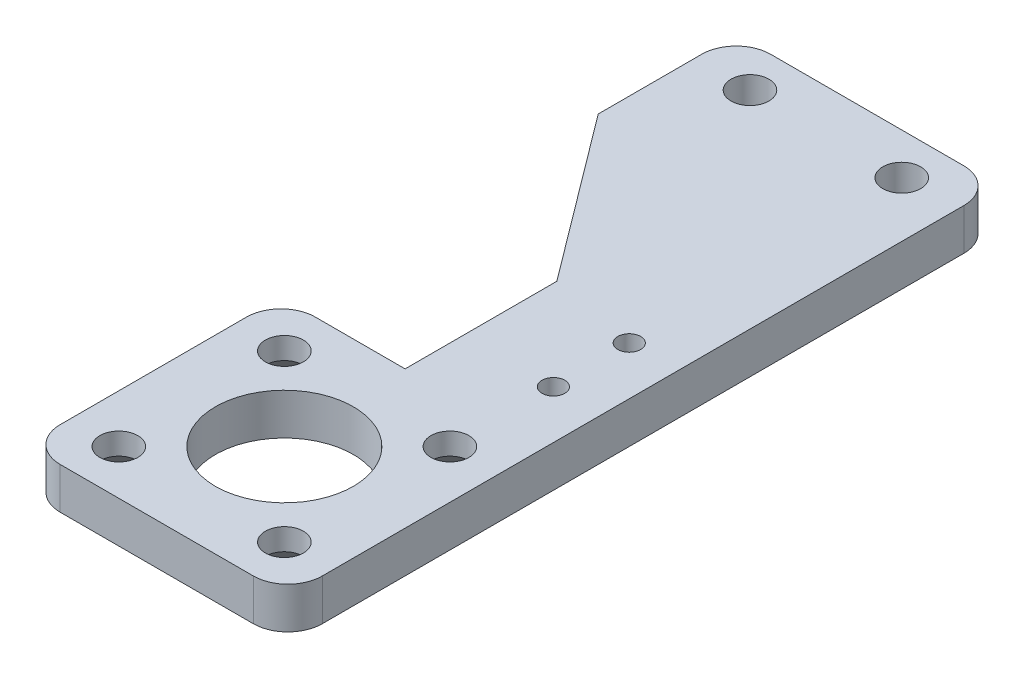
ISO-10303-21;
HEADER;
FILE_DESCRIPTION(('STEP AP214'),'2;1');
FILE_NAME('part.step','',(''),(''),'','','');
FILE_SCHEMA(('AUTOMOTIVE_DESIGN { 1 0 10303 214 1 1 1 1 }'));
ENDSEC;
DATA;
#1=APPLICATION_CONTEXT('core data for automotive mechanical design processes');
#2=APPLICATION_PROTOCOL_DEFINITION('international standard','automotive_design',2000,#1);
#3=PRODUCT_CONTEXT('',#1,'mechanical');
#4=PRODUCT('Part','Part','',(#3));
#5=PRODUCT_RELATED_PRODUCT_CATEGORY('part','',(#4));
#6=PRODUCT_DEFINITION_FORMATION('','',#4);
#7=PRODUCT_DEFINITION_CONTEXT('part definition',#1,'design');
#8=PRODUCT_DEFINITION('design','',#6,#7);
#9=PRODUCT_DEFINITION_SHAPE('','',#8);
#10=(LENGTH_UNIT() NAMED_UNIT(*) SI_UNIT(.MILLI.,.METRE.));
#11=(NAMED_UNIT(*) PLANE_ANGLE_UNIT() SI_UNIT($,.RADIAN.));
#12=(NAMED_UNIT(*) SI_UNIT($,.STERADIAN.) SOLID_ANGLE_UNIT());
#13=UNCERTAINTY_MEASURE_WITH_UNIT(LENGTH_MEASURE(1.E-05),#10,'distance_accuracy_value','');
#14=(GEOMETRIC_REPRESENTATION_CONTEXT(3) GLOBAL_UNCERTAINTY_ASSIGNED_CONTEXT((#13)) GLOBAL_UNIT_ASSIGNED_CONTEXT((#10,
#11,#12)) REPRESENTATION_CONTEXT('',''));
#15=CARTESIAN_POINT('',(0.,0.,0.));
#16=DIRECTION('',(0.,0.,1.));
#17=DIRECTION('',(1.,0.,0.));
#18=AXIS2_PLACEMENT_3D('',#15,#16,#17);
#19=CARTESIAN_POINT('',(-19.,-3.,51.5));
#20=DIRECTION('',(0.,1.,0.));
#21=DIRECTION('',(0.,0.,1.));
#22=AXIS2_PLACEMENT_3D('',#19,#20,#21);
#23=PLANE('',#22);
#24=CARTESIAN_POINT('',(11.,-3.,-45.5));
#25=DIRECTION('',(0.,1.,0.));
#26=DIRECTION('',(0.,0.,1.));
#27=AXIS2_PLACEMENT_3D('',#24,#25,#26);
#28=CIRCLE('',#27,2.75);
#29=CARTESIAN_POINT('',(11.,-3.,-42.75));
#30=VERTEX_POINT('',#29);
#31=EDGE_CURVE('E604',#30,#30,#28,.T.);
#32=ORIENTED_EDGE('',*,*,#31,.T.);
#33=EDGE_LOOP('',(#32));
#34=FACE_BOUND('',#33,.T.);
#35=CARTESIAN_POINT('',(-11.,-3.,-45.5));
#36=DIRECTION('',(0.,1.,0.));
#37=DIRECTION('',(0.,0.,1.));
#38=AXIS2_PLACEMENT_3D('',#35,#36,#37);
#39=CIRCLE('',#38,2.75);
#40=CARTESIAN_POINT('',(-11.,-3.,-42.75));
#41=VERTEX_POINT('',#40);
#42=EDGE_CURVE('E602',#41,#41,#39,.T.);
#43=ORIENTED_EDGE('',*,*,#42,.T.);
#44=EDGE_LOOP('',(#43));
#45=FACE_BOUND('',#44,.T.);
#46=CARTESIAN_POINT('',(12.,-3.,-5.));
#47=DIRECTION('',(0.,1.,0.));
#48=DIRECTION('',(0.,0.,1.));
#49=AXIS2_PLACEMENT_3D('',#46,#47,#48);
#50=CIRCLE('',#49,1.65);
#51=CARTESIAN_POINT('',(12.,-3.,-3.35));
#52=VERTEX_POINT('',#51);
#53=EDGE_CURVE('E598',#52,#52,#50,.T.);
#54=ORIENTED_EDGE('',*,*,#53,.T.);
#55=EDGE_LOOP('',(#54));
#56=FACE_BOUND('',#55,.T.);
#57=CARTESIAN_POINT('',(12.,-3.,6.));
#58=DIRECTION('',(0.,1.,0.));
#59=DIRECTION('',(0.,0.,1.));
#60=AXIS2_PLACEMENT_3D('',#57,#58,#59);
#61=CIRCLE('',#60,1.65);
#62=CARTESIAN_POINT('',(12.,-3.,7.65));
#63=VERTEX_POINT('',#62);
#64=EDGE_CURVE('E594',#63,#63,#61,.T.);
#65=ORIENTED_EDGE('',*,*,#64,.T.);
#66=EDGE_LOOP('',(#65));
#67=FACE_BOUND('',#66,.T.);
#68=CARTESIAN_POINT('',(12.,-3.,45.));
#69=DIRECTION('',(0.,-1.,0.));
#70=DIRECTION('',(0.,0.,-1.));
#71=AXIS2_PLACEMENT_3D('',#68,#69,#70);
#72=CIRCLE('',#71,5.6);
#73=CARTESIAN_POINT('',(12.,-3.,39.4));
#74=VERTEX_POINT('',#73);
#75=EDGE_CURVE('E591',#74,#74,#72,.T.);
#76=ORIENTED_EDGE('',*,*,#75,.F.);
#77=EDGE_LOOP('',(#76));
#78=FACE_BOUND('',#77,.T.);
#79=DIRECTION('',(0.,0.,1.));
#80=VECTOR('',#79,1.);
#81=CARTESIAN_POINT('',(-19.,-3.,-51.5));
#82=LINE('',#81,#80);
#83=CARTESIAN_POINT('',(-19.,-3.,19.5));
#84=VERTEX_POINT('',#83);
#85=CARTESIAN_POINT('',(-19.,-3.,46.5));
#86=VERTEX_POINT('',#85);
#87=EDGE_CURVE('E166',#84,#86,#82,.T.);
#88=ORIENTED_EDGE('',*,*,#87,.F.);
#89=CARTESIAN_POINT('',(-14.,-3.,19.5));
#90=DIRECTION('',(0.,1.,0.));
#91=DIRECTION('',(0.,0.,1.));
#92=AXIS2_PLACEMENT_3D('',#89,#90,#91);
#93=CIRCLE('',#92,5.);
#94=CARTESIAN_POINT('',(-14.,-3.,14.5));
#95=VERTEX_POINT('',#94);
#96=EDGE_CURVE('E214',#84,#95,#93,.F.);
#97=ORIENTED_EDGE('',*,*,#96,.T.);
#98=DIRECTION('',(1.,0.,0.));
#99=VECTOR('',#98,1.);
#100=CARTESIAN_POINT('',(-19.,-3.,14.5));
#101=LINE('',#100,#99);
#102=CARTESIAN_POINT('',(-1.00000000000001,-3.,14.5));
#103=VERTEX_POINT('',#102);
#104=EDGE_CURVE('E155',#95,#103,#101,.T.);
#105=ORIENTED_EDGE('',*,*,#104,.T.);
#106=DIRECTION('',(0.,0.,-1.));
#107=VECTOR('',#106,1.);
#108=CARTESIAN_POINT('',(-1.00000000000001,-3.,14.5));
#109=LINE('',#108,#107);
#110=CARTESIAN_POINT('',(-1.00000000000001,-3.,-7.5));
#111=VERTEX_POINT('',#110);
#112=EDGE_CURVE('E135',#103,#111,#109,.T.);
#113=ORIENTED_EDGE('',*,*,#112,.T.);
#114=DIRECTION('',(-0.6,0.,-0.8));
#115=VECTOR('',#114,1.);
#116=CARTESIAN_POINT('',(-1.00000000000001,-3.,-7.5));
#117=LINE('',#116,#115);
#118=CARTESIAN_POINT('',(-19.,-3.,-31.5));
#119=VERTEX_POINT('',#118);
#120=EDGE_CURVE('E147',#111,#119,#117,.T.);
#121=ORIENTED_EDGE('',*,*,#120,.T.);
#122=CARTESIAN_POINT('',(-19.,-3.,-46.5));
#123=VERTEX_POINT('',#122);
#124=EDGE_CURVE('E182',#123,#119,#82,.T.);
#125=ORIENTED_EDGE('',*,*,#124,.F.);
#126=CARTESIAN_POINT('',(-14.,-3.,-46.5));
#127=DIRECTION('',(0.,1.,0.));
#128=DIRECTION('',(0.,0.,1.));
#129=AXIS2_PLACEMENT_3D('',#126,#127,#128);
#130=CIRCLE('',#129,5.);
#131=CARTESIAN_POINT('',(-14.,-3.,-51.5));
#132=VERTEX_POINT('',#131);
#133=EDGE_CURVE('E212',#123,#132,#130,.F.);
#134=ORIENTED_EDGE('',*,*,#133,.T.);
#135=DIRECTION('',(-1.,0.,0.));
#136=VECTOR('',#135,1.);
#137=CARTESIAN_POINT('',(-19.,-3.,-51.5));
#138=LINE('',#137,#136);
#139=CARTESIAN_POINT('',(14.,-3.,-51.5));
#140=VERTEX_POINT('',#139);
#141=EDGE_CURVE('E189',#140,#132,#138,.T.);
#142=ORIENTED_EDGE('',*,*,#141,.F.);
#143=CARTESIAN_POINT('',(14.,-3.,-46.5));
#144=DIRECTION('',(0.,1.,0.));
#145=DIRECTION('',(0.,0.,1.));
#146=AXIS2_PLACEMENT_3D('',#143,#144,#145);
#147=CIRCLE('',#146,5.);
#148=CARTESIAN_POINT('',(19.,-3.,-46.5));
#149=VERTEX_POINT('',#148);
#150=EDGE_CURVE('E210',#140,#149,#147,.F.);
#151=ORIENTED_EDGE('',*,*,#150,.T.);
#152=DIRECTION('',(0.,0.,-1.));
#153=VECTOR('',#152,1.);
#154=CARTESIAN_POINT('',(19.,-3.,-51.5));
#155=LINE('',#154,#153);
#156=CARTESIAN_POINT('',(19.,-3.,46.5));
#157=VERTEX_POINT('',#156);
#158=EDGE_CURVE('E186',#157,#149,#155,.T.);
#159=ORIENTED_EDGE('',*,*,#158,.F.);
#160=CARTESIAN_POINT('',(14.,-3.,46.5));
#161=DIRECTION('',(0.,1.,0.));
#162=DIRECTION('',(0.,0.,1.));
#163=AXIS2_PLACEMENT_3D('',#160,#161,#162);
#164=CIRCLE('',#163,5.);
#165=CARTESIAN_POINT('',(14.,-3.,51.5));
#166=VERTEX_POINT('',#165);
#167=EDGE_CURVE('E49',#157,#166,#164,.F.);
#168=ORIENTED_EDGE('',*,*,#167,.T.);
#169=DIRECTION('',(1.,0.,0.));
#170=VECTOR('',#169,1.);
#171=CARTESIAN_POINT('',(-19.,-3.,51.5));
#172=LINE('',#171,#170);
#173=CARTESIAN_POINT('',(-14.,-3.,51.5));
#174=VERTEX_POINT('',#173);
#175=EDGE_CURVE('E184',#174,#166,#172,.T.);
#176=ORIENTED_EDGE('',*,*,#175,.F.);
#177=CARTESIAN_POINT('',(-14.,-3.,46.5));
#178=DIRECTION('',(0.,1.,0.));
#179=DIRECTION('',(0.,0.,1.));
#180=AXIS2_PLACEMENT_3D('',#177,#178,#179);
#181=CIRCLE('',#180,5.);
#182=EDGE_CURVE('E57',#174,#86,#181,.F.);
#183=ORIENTED_EDGE('',*,*,#182,.T.);
#184=EDGE_LOOP('',(#88,#97,#105,#113,#121,#125,#134,#142,#151,#159,#168,#176,#183));
#185=FACE_BOUND('',#184,.T.);
#186=CARTESIAN_POINT('',(0.,-3.,33.));
#187=DIRECTION('',(0.,1.,0.));
#188=DIRECTION('',(0.,0.,1.));
#189=AXIS2_PLACEMENT_3D('',#186,#187,#188);
#190=CIRCLE('',#189,10.);
#191=CARTESIAN_POINT('',(0.,-3.,43.));
#192=VERTEX_POINT('',#191);
#193=EDGE_CURVE('E163',#192,#192,#190,.T.);
#194=ORIENTED_EDGE('',*,*,#193,.T.);
#195=EDGE_LOOP('',(#194));
#196=FACE_BOUND('',#195,.T.);
#197=CARTESIAN_POINT('',(12.,-3.,21.));
#198=DIRECTION('',(0.,-1.,0.));
#199=DIRECTION('',(0.,0.,-1.));
#200=AXIS2_PLACEMENT_3D('',#197,#198,#199);
#201=CIRCLE('',#200,5.6);
#202=CARTESIAN_POINT('',(12.,-3.,15.4));
#203=VERTEX_POINT('',#202);
#204=EDGE_CURVE('E570',#203,#203,#201,.T.);
#205=ORIENTED_EDGE('',*,*,#204,.F.);
#206=EDGE_LOOP('',(#205));
#207=FACE_BOUND('',#206,.T.);
#208=CARTESIAN_POINT('',(-12.,-3.,21.));
#209=DIRECTION('',(0.,-1.,0.));
#210=DIRECTION('',(0.,0.,-1.));
#211=AXIS2_PLACEMENT_3D('',#208,#209,#210);
#212=CIRCLE('',#211,5.6);
#213=CARTESIAN_POINT('',(-12.,-3.,15.4));
#214=VERTEX_POINT('',#213);
#215=EDGE_CURVE('E577',#214,#214,#212,.T.);
#216=ORIENTED_EDGE('',*,*,#215,.F.);
#217=EDGE_LOOP('',(#216));
#218=FACE_BOUND('',#217,.T.);
#219=CARTESIAN_POINT('',(-12.,-3.,45.));
#220=DIRECTION('',(0.,-1.,0.));
#221=DIRECTION('',(0.,0.,-1.));
#222=AXIS2_PLACEMENT_3D('',#219,#220,#221);
#223=CIRCLE('',#222,5.6);
#224=CARTESIAN_POINT('',(-12.,-3.,39.4));
#225=VERTEX_POINT('',#224);
#226=EDGE_CURVE('E584',#225,#225,#223,.T.);
#227=ORIENTED_EDGE('',*,*,#226,.F.);
#228=EDGE_LOOP('',(#227));
#229=FACE_BOUND('',#228,.T.);
#230=ADVANCED_FACE('F34',(#34,#45,#56,#67,#78,#185,#196,#207,#218,#229),#23,.F.);
#231=CARTESIAN_POINT('',(-19.,3.,-51.5));
#232=DIRECTION('',(1.,0.,0.));
#233=DIRECTION('',(0.,0.,-1.));
#234=AXIS2_PLACEMENT_3D('',#231,#232,#233);
#235=PLANE('',#234);
#236=DIRECTION('',(0.,0.,1.));
#237=VECTOR('',#236,1.);
#238=CARTESIAN_POINT('',(-19.,3.,-51.5));
#239=LINE('',#238,#237);
#240=CARTESIAN_POINT('',(-19.,3.,-46.5));
#241=VERTEX_POINT('',#240);
#242=CARTESIAN_POINT('',(-19.,3.,-31.5));
#243=VERTEX_POINT('',#242);
#244=EDGE_CURVE('E169',#241,#243,#239,.T.);
#245=ORIENTED_EDGE('',*,*,#244,.F.);
#246=DIRECTION('',(0.,-1.,0.));
#247=VECTOR('',#246,1.);
#248=CARTESIAN_POINT('',(-19.,3.,-46.5));
#249=LINE('',#248,#247);
#250=EDGE_CURVE('E216',#241,#123,#249,.T.);
#251=ORIENTED_EDGE('',*,*,#250,.T.);
#252=ORIENTED_EDGE('',*,*,#124,.T.);
#253=DIRECTION('',(0.,1.,0.));
#254=VECTOR('',#253,1.);
#255=CARTESIAN_POINT('',(-19.,-3.,-31.5));
#256=LINE('',#255,#254);
#257=EDGE_CURVE('E142',#119,#243,#256,.T.);
#258=ORIENTED_EDGE('',*,*,#257,.T.);
#259=EDGE_LOOP('',(#245,#251,#252,#258));
#260=FACE_BOUND('',#259,.T.);
#261=ADVANCED_FACE('F259',(#260),#235,.F.);
#262=CARTESIAN_POINT('',(-19.,3.,19.5));
#263=VERTEX_POINT('',#262);
#264=CARTESIAN_POINT('',(-19.,3.,46.5));
#265=VERTEX_POINT('',#264);
#266=EDGE_CURVE('E172',#263,#265,#239,.T.);
#267=ORIENTED_EDGE('',*,*,#266,.F.);
#268=DIRECTION('',(0.,1.,0.));
#269=VECTOR('',#268,1.);
#270=CARTESIAN_POINT('',(-19.,3.,19.5));
#271=LINE('',#270,#269);
#272=EDGE_CURVE('E206',#263,#84,#271,.F.);
#273=ORIENTED_EDGE('',*,*,#272,.T.);
#274=ORIENTED_EDGE('',*,*,#87,.T.);
#275=DIRECTION('',(0.,-1.,0.));
#276=VECTOR('',#275,1.);
#277=CARTESIAN_POINT('',(-19.,3.,46.5));
#278=LINE('',#277,#276);
#279=EDGE_CURVE('E204',#86,#265,#278,.F.);
#280=ORIENTED_EDGE('',*,*,#279,.T.);
#281=EDGE_LOOP('',(#267,#273,#274,#280));
#282=FACE_BOUND('',#281,.T.);
#283=ADVANCED_FACE('F270',(#282),#235,.F.);
#284=CARTESIAN_POINT('',(-19.,3.,51.5));
#285=DIRECTION('',(0.,0.,-1.));
#286=DIRECTION('',(-1.,0.,0.));
#287=AXIS2_PLACEMENT_3D('',#284,#285,#286);
#288=PLANE('',#287);
#289=DIRECTION('',(1.,0.,0.));
#290=VECTOR('',#289,1.);
#291=CARTESIAN_POINT('',(-19.,3.,51.5));
#292=LINE('',#291,#290);
#293=CARTESIAN_POINT('',(-14.,3.,51.5));
#294=VERTEX_POINT('',#293);
#295=CARTESIAN_POINT('',(14.,3.,51.5));
#296=VERTEX_POINT('',#295);
#297=EDGE_CURVE('E171',#294,#296,#292,.T.);
#298=ORIENTED_EDGE('',*,*,#297,.F.);
#299=DIRECTION('',(0.,-1.,0.));
#300=VECTOR('',#299,1.);
#301=CARTESIAN_POINT('',(-14.,3.,51.5));
#302=LINE('',#301,#300);
#303=EDGE_CURVE('E11',#294,#174,#302,.T.);
#304=ORIENTED_EDGE('',*,*,#303,.T.);
#305=ORIENTED_EDGE('',*,*,#175,.T.);
#306=DIRECTION('',(0.,-1.,0.));
#307=VECTOR('',#306,1.);
#308=CARTESIAN_POINT('',(14.,3.,51.5));
#309=LINE('',#308,#307);
#310=EDGE_CURVE('E42',#166,#296,#309,.F.);
#311=ORIENTED_EDGE('',*,*,#310,.T.);
#312=EDGE_LOOP('',(#298,#304,#305,#311));
#313=FACE_BOUND('',#312,.T.);
#314=ADVANCED_FACE('F231',(#313),#288,.F.);
#315=CARTESIAN_POINT('',(19.,3.,-51.5));
#316=DIRECTION('',(-1.,0.,0.));
#317=DIRECTION('',(0.,0.,1.));
#318=AXIS2_PLACEMENT_3D('',#315,#316,#317);
#319=PLANE('',#318);
#320=ORIENTED_EDGE('',*,*,#158,.T.);
#321=DIRECTION('',(0.,-1.,0.));
#322=VECTOR('',#321,1.);
#323=CARTESIAN_POINT('',(19.,3.,-46.5));
#324=LINE('',#323,#322);
#325=CARTESIAN_POINT('',(19.,3.,-46.5));
#326=VERTEX_POINT('',#325);
#327=EDGE_CURVE('E227',#149,#326,#324,.F.);
#328=ORIENTED_EDGE('',*,*,#327,.T.);
#329=DIRECTION('',(0.,0.,-1.));
#330=VECTOR('',#329,1.);
#331=CARTESIAN_POINT('',(19.,3.,-51.5));
#332=LINE('',#331,#330);
#333=CARTESIAN_POINT('',(19.,3.,46.5));
#334=VERTEX_POINT('',#333);
#335=EDGE_CURVE('E175',#334,#326,#332,.T.);
#336=ORIENTED_EDGE('',*,*,#335,.F.);
#337=DIRECTION('',(0.,-1.,0.));
#338=VECTOR('',#337,1.);
#339=CARTESIAN_POINT('',(19.,3.,46.5));
#340=LINE('',#339,#338);
#341=EDGE_CURVE('E224',#334,#157,#340,.T.);
#342=ORIENTED_EDGE('',*,*,#341,.T.);
#343=EDGE_LOOP('',(#320,#328,#336,#342));
#344=FACE_BOUND('',#343,.T.);
#345=ADVANCED_FACE('F242',(#344),#319,.F.);
#346=CARTESIAN_POINT('',(-19.,3.,-51.5));
#347=DIRECTION('',(0.,0.,1.));
#348=DIRECTION('',(1.,0.,0.));
#349=AXIS2_PLACEMENT_3D('',#346,#347,#348);
#350=PLANE('',#349);
#351=ORIENTED_EDGE('',*,*,#141,.T.);
#352=DIRECTION('',(0.,-1.,0.));
#353=VECTOR('',#352,1.);
#354=CARTESIAN_POINT('',(-14.,3.,-51.5));
#355=LINE('',#354,#353);
#356=CARTESIAN_POINT('',(-14.,3.,-51.5));
#357=VERTEX_POINT('',#356);
#358=EDGE_CURVE('E222',#132,#357,#355,.F.);
#359=ORIENTED_EDGE('',*,*,#358,.T.);
#360=DIRECTION('',(-1.,0.,0.));
#361=VECTOR('',#360,1.);
#362=CARTESIAN_POINT('',(-19.,3.,-51.5));
#363=LINE('',#362,#361);
#364=CARTESIAN_POINT('',(14.,3.,-51.5));
#365=VERTEX_POINT('',#364);
#366=EDGE_CURVE('E178',#365,#357,#363,.T.);
#367=ORIENTED_EDGE('',*,*,#366,.F.);
#368=DIRECTION('',(0.,-1.,0.));
#369=VECTOR('',#368,1.);
#370=CARTESIAN_POINT('',(14.,3.,-51.5));
#371=LINE('',#370,#369);
#372=EDGE_CURVE('E219',#365,#140,#371,.T.);
#373=ORIENTED_EDGE('',*,*,#372,.T.);
#374=EDGE_LOOP('',(#351,#359,#367,#373));
#375=FACE_BOUND('',#374,.T.);
#376=ADVANCED_FACE('F251',(#375),#350,.F.);
#377=CARTESIAN_POINT('',(-19.,3.,51.5));
#378=DIRECTION('',(0.,1.,0.));
#379=DIRECTION('',(0.,0.,1.));
#380=AXIS2_PLACEMENT_3D('',#377,#378,#379);
#381=PLANE('',#380);
#382=CARTESIAN_POINT('',(11.,3.,-45.5));
#383=DIRECTION('',(0.,1.,0.));
#384=DIRECTION('',(0.,0.,1.));
#385=AXIS2_PLACEMENT_3D('',#382,#383,#384);
#386=CIRCLE('',#385,2.75);
#387=CARTESIAN_POINT('',(11.,3.,-42.75));
#388=VERTEX_POINT('',#387);
#389=EDGE_CURVE('E530',#388,#388,#386,.T.);
#390=ORIENTED_EDGE('',*,*,#389,.F.);
#391=EDGE_LOOP('',(#390));
#392=FACE_BOUND('',#391,.T.);
#393=CARTESIAN_POINT('',(-11.,3.,-45.5));
#394=DIRECTION('',(0.,1.,0.));
#395=DIRECTION('',(0.,0.,1.));
#396=AXIS2_PLACEMENT_3D('',#393,#394,#395);
#397=CIRCLE('',#396,2.75);
#398=CARTESIAN_POINT('',(-11.,3.,-42.75));
#399=VERTEX_POINT('',#398);
#400=EDGE_CURVE('E534',#399,#399,#397,.T.);
#401=ORIENTED_EDGE('',*,*,#400,.F.);
#402=EDGE_LOOP('',(#401));
#403=FACE_BOUND('',#402,.T.);
#404=CARTESIAN_POINT('',(12.,3.,-5.));
#405=DIRECTION('',(0.,1.,0.));
#406=DIRECTION('',(0.,0.,1.));
#407=AXIS2_PLACEMENT_3D('',#404,#405,#406);
#408=CIRCLE('',#407,1.65);
#409=CARTESIAN_POINT('',(12.,3.,-3.35));
#410=VERTEX_POINT('',#409);
#411=EDGE_CURVE('E538',#410,#410,#408,.T.);
#412=ORIENTED_EDGE('',*,*,#411,.F.);
#413=EDGE_LOOP('',(#412));
#414=FACE_BOUND('',#413,.T.);
#415=CARTESIAN_POINT('',(12.,3.,6.));
#416=DIRECTION('',(0.,1.,0.));
#417=DIRECTION('',(0.,0.,1.));
#418=AXIS2_PLACEMENT_3D('',#415,#416,#417);
#419=CIRCLE('',#418,1.65);
#420=CARTESIAN_POINT('',(12.,3.,7.65));
#421=VERTEX_POINT('',#420);
#422=EDGE_CURVE('E542',#421,#421,#419,.T.);
#423=ORIENTED_EDGE('',*,*,#422,.F.);
#424=EDGE_LOOP('',(#423));
#425=FACE_BOUND('',#424,.T.);
#426=CARTESIAN_POINT('',(12.,3.,45.));
#427=DIRECTION('',(0.,-1.,0.));
#428=DIRECTION('',(0.,0.,-1.));
#429=AXIS2_PLACEMENT_3D('',#426,#427,#428);
#430=CIRCLE('',#429,2.75);
#431=CARTESIAN_POINT('',(12.,3.,42.25));
#432=VERTEX_POINT('',#431);
#433=EDGE_CURVE('E546',#432,#432,#430,.T.);
#434=ORIENTED_EDGE('',*,*,#433,.T.);
#435=EDGE_LOOP('',(#434));
#436=FACE_BOUND('',#435,.T.);
#437=CARTESIAN_POINT('',(-12.,3.,45.));
#438=DIRECTION('',(0.,-1.,0.));
#439=DIRECTION('',(0.,0.,-1.));
#440=AXIS2_PLACEMENT_3D('',#437,#438,#439);
#441=CIRCLE('',#440,2.75);
#442=CARTESIAN_POINT('',(-12.,3.,42.25));
#443=VERTEX_POINT('',#442);
#444=EDGE_CURVE('E550',#443,#443,#441,.T.);
#445=ORIENTED_EDGE('',*,*,#444,.T.);
#446=EDGE_LOOP('',(#445));
#447=FACE_BOUND('',#446,.T.);
#448=CARTESIAN_POINT('',(-12.,3.,21.));
#449=DIRECTION('',(0.,-1.,0.));
#450=DIRECTION('',(0.,0.,-1.));
#451=AXIS2_PLACEMENT_3D('',#448,#449,#450);
#452=CIRCLE('',#451,2.75);
#453=CARTESIAN_POINT('',(-12.,3.,18.25));
#454=VERTEX_POINT('',#453);
#455=EDGE_CURVE('E554',#454,#454,#452,.T.);
#456=ORIENTED_EDGE('',*,*,#455,.T.);
#457=EDGE_LOOP('',(#456));
#458=FACE_BOUND('',#457,.T.);
#459=CARTESIAN_POINT('',(12.,3.,21.));
#460=DIRECTION('',(0.,-1.,0.));
#461=DIRECTION('',(0.,0.,-1.));
#462=AXIS2_PLACEMENT_3D('',#459,#460,#461);
#463=CIRCLE('',#462,2.75);
#464=CARTESIAN_POINT('',(12.,3.,18.25));
#465=VERTEX_POINT('',#464);
#466=EDGE_CURVE('E558',#465,#465,#463,.T.);
#467=ORIENTED_EDGE('',*,*,#466,.T.);
#468=EDGE_LOOP('',(#467));
#469=FACE_BOUND('',#468,.T.);
#470=CARTESIAN_POINT('',(0.,3.,33.));
#471=DIRECTION('',(0.,1.,0.));
#472=DIRECTION('',(0.,0.,1.));
#473=AXIS2_PLACEMENT_3D('',#470,#471,#472);
#474=CIRCLE('',#473,10.);
#475=CARTESIAN_POINT('',(0.,3.,43.));
#476=VERTEX_POINT('',#475);
#477=EDGE_CURVE('E561',#476,#476,#474,.T.);
#478=ORIENTED_EDGE('',*,*,#477,.F.);
#479=EDGE_LOOP('',(#478));
#480=FACE_BOUND('',#479,.T.);
#481=DIRECTION('',(1.,0.,0.));
#482=VECTOR('',#481,1.);
#483=CARTESIAN_POINT('',(-19.,3.,14.5));
#484=LINE('',#483,#482);
#485=CARTESIAN_POINT('',(-14.,3.,14.5));
#486=VERTEX_POINT('',#485);
#487=CARTESIAN_POINT('',(-1.00000000000001,3.,14.5));
#488=VERTEX_POINT('',#487);
#489=EDGE_CURVE('E161',#486,#488,#484,.T.);
#490=ORIENTED_EDGE('',*,*,#489,.F.);
#491=CARTESIAN_POINT('',(-14.,3.,19.5));
#492=DIRECTION('',(0.,1.,0.));
#493=DIRECTION('',(0.,0.,1.));
#494=AXIS2_PLACEMENT_3D('',#491,#492,#493);
#495=CIRCLE('',#494,5.);
#496=EDGE_CURVE('E202',#486,#263,#495,.T.);
#497=ORIENTED_EDGE('',*,*,#496,.T.);
#498=ORIENTED_EDGE('',*,*,#266,.T.);
#499=CARTESIAN_POINT('',(-14.,3.,46.5));
#500=DIRECTION('',(0.,1.,0.));
#501=DIRECTION('',(0.,0.,1.));
#502=AXIS2_PLACEMENT_3D('',#499,#500,#501);
#503=CIRCLE('',#502,5.);
#504=EDGE_CURVE('E196',#265,#294,#503,.T.);
#505=ORIENTED_EDGE('',*,*,#504,.T.);
#506=ORIENTED_EDGE('',*,*,#297,.T.);
#507=CARTESIAN_POINT('',(14.,3.,46.5));
#508=DIRECTION('',(0.,1.,0.));
#509=DIRECTION('',(0.,0.,1.));
#510=AXIS2_PLACEMENT_3D('',#507,#508,#509);
#511=CIRCLE('',#510,5.);
#512=EDGE_CURVE('E194',#296,#334,#511,.T.);
#513=ORIENTED_EDGE('',*,*,#512,.T.);
#514=ORIENTED_EDGE('',*,*,#335,.T.);
#515=CARTESIAN_POINT('',(14.,3.,-46.5));
#516=DIRECTION('',(0.,1.,0.));
#517=DIRECTION('',(0.,0.,1.));
#518=AXIS2_PLACEMENT_3D('',#515,#516,#517);
#519=CIRCLE('',#518,5.);
#520=EDGE_CURVE('E198',#326,#365,#519,.T.);
#521=ORIENTED_EDGE('',*,*,#520,.T.);
#522=ORIENTED_EDGE('',*,*,#366,.T.);
#523=CARTESIAN_POINT('',(-14.,3.,-46.5));
#524=DIRECTION('',(0.,1.,0.));
#525=DIRECTION('',(0.,0.,1.));
#526=AXIS2_PLACEMENT_3D('',#523,#524,#525);
#527=CIRCLE('',#526,5.);
#528=EDGE_CURVE('E200',#357,#241,#527,.T.);
#529=ORIENTED_EDGE('',*,*,#528,.T.);
#530=ORIENTED_EDGE('',*,*,#244,.T.);
#531=DIRECTION('',(-0.6,0.,-0.8));
#532=VECTOR('',#531,1.);
#533=CARTESIAN_POINT('',(-1.00000000000001,3.,-7.5));
#534=LINE('',#533,#532);
#535=CARTESIAN_POINT('',(-1.00000000000001,3.,-7.5));
#536=VERTEX_POINT('',#535);
#537=EDGE_CURVE('E157',#536,#243,#534,.T.);
#538=ORIENTED_EDGE('',*,*,#537,.F.);
#539=DIRECTION('',(0.,0.,-1.));
#540=VECTOR('',#539,1.);
#541=CARTESIAN_POINT('',(-1.00000000000001,3.,14.5));
#542=LINE('',#541,#540);
#543=EDGE_CURVE('E138',#488,#536,#542,.T.);
#544=ORIENTED_EDGE('',*,*,#543,.F.);
#545=EDGE_LOOP('',(#490,#497,#498,#505,#506,#513,#514,#521,#522,#529,#530,#538,#544));
#546=FACE_BOUND('',#545,.T.);
#547=ADVANCED_FACE('F236',(#392,#403,#414,#425,#436,#447,#458,#469,#480,#546),#381,.T.);
#548=CARTESIAN_POINT('',(-1.00000000000001,-3.,-7.5));
#549=DIRECTION('',(0.8,0.,-0.6));
#550=DIRECTION('',(-0.6,0.,-0.8));
#551=AXIS2_PLACEMENT_3D('',#548,#549,#550);
#552=PLANE('',#551);
#553=ORIENTED_EDGE('',*,*,#537,.T.);
#554=ORIENTED_EDGE('',*,*,#257,.F.);
#555=ORIENTED_EDGE('',*,*,#120,.F.);
#556=DIRECTION('',(0.,1.,0.));
#557=VECTOR('',#556,1.);
#558=CARTESIAN_POINT('',(-1.00000000000001,-3.,-7.5));
#559=LINE('',#558,#557);
#560=EDGE_CURVE('E130',#111,#536,#559,.T.);
#561=ORIENTED_EDGE('',*,*,#560,.T.);
#562=EDGE_LOOP('',(#553,#554,#555,#561));
#563=FACE_BOUND('',#562,.T.);
#564=ADVANCED_FACE('F148',(#563),#552,.F.);
#565=CARTESIAN_POINT('',(-1.00000000000001,-3.,14.5));
#566=DIRECTION('',(1.,0.,0.));
#567=DIRECTION('',(0.,0.,-1.));
#568=AXIS2_PLACEMENT_3D('',#565,#566,#567);
#569=PLANE('',#568);
#570=ORIENTED_EDGE('',*,*,#543,.T.);
#571=ORIENTED_EDGE('',*,*,#560,.F.);
#572=ORIENTED_EDGE('',*,*,#112,.F.);
#573=DIRECTION('',(0.,1.,0.));
#574=VECTOR('',#573,1.);
#575=CARTESIAN_POINT('',(-1.00000000000001,-3.,14.5));
#576=LINE('',#575,#574);
#577=EDGE_CURVE('E143',#103,#488,#576,.T.);
#578=ORIENTED_EDGE('',*,*,#577,.T.);
#579=EDGE_LOOP('',(#570,#571,#572,#578));
#580=FACE_BOUND('',#579,.T.);
#581=ADVANCED_FACE('F132',(#580),#569,.F.);
#582=CARTESIAN_POINT('',(-19.,-3.,14.5));
#583=DIRECTION('',(0.,0.,1.));
#584=DIRECTION('',(1.,0.,0.));
#585=AXIS2_PLACEMENT_3D('',#582,#583,#584);
#586=PLANE('',#585);
#587=ORIENTED_EDGE('',*,*,#104,.F.);
#588=DIRECTION('',(0.,1.,0.));
#589=VECTOR('',#588,1.);
#590=CARTESIAN_POINT('',(-14.,-3.,14.5));
#591=LINE('',#590,#589);
#592=EDGE_CURVE('E181',#95,#486,#591,.T.);
#593=ORIENTED_EDGE('',*,*,#592,.T.);
#594=ORIENTED_EDGE('',*,*,#489,.T.);
#595=ORIENTED_EDGE('',*,*,#577,.F.);
#596=EDGE_LOOP('',(#587,#593,#594,#595));
#597=FACE_BOUND('',#596,.T.);
#598=ADVANCED_FACE('F262',(#597),#586,.F.);
#599=CARTESIAN_POINT('',(0.,-3.,33.));
#600=DIRECTION('',(0.,1.,0.));
#601=DIRECTION('',(0.,0.,1.));
#602=AXIS2_PLACEMENT_3D('',#599,#600,#601);
#603=CYLINDRICAL_SURFACE('',#602,10.);
#604=ORIENTED_EDGE('',*,*,#193,.F.);
#605=EDGE_LOOP('',(#604));
#606=FACE_BOUND('',#605,.T.);
#607=ORIENTED_EDGE('',*,*,#477,.T.);
#608=EDGE_LOOP('',(#607));
#609=FACE_BOUND('',#608,.T.);
#610=ADVANCED_FACE('F437',(#606,#609),#603,.F.);
#611=CARTESIAN_POINT('',(12.,-3.,21.));
#612=DIRECTION('',(0.,-1.,0.));
#613=DIRECTION('',(0.,0.,-1.));
#614=AXIS2_PLACEMENT_3D('',#611,#612,#613);
#615=CYLINDRICAL_SURFACE('',#614,2.75);
#616=ORIENTED_EDGE('',*,*,#466,.F.);
#617=EDGE_LOOP('',(#616));
#618=FACE_BOUND('',#617,.T.);
#619=CARTESIAN_POINT('',(12.,-0.150000000000003,21.));
#620=DIRECTION('',(0.,-1.,0.));
#621=DIRECTION('',(0.,0.,-1.));
#622=AXIS2_PLACEMENT_3D('',#619,#620,#621);
#623=CIRCLE('',#622,2.75);
#624=CARTESIAN_POINT('',(12.,-0.150000000000003,18.25));
#625=VERTEX_POINT('',#624);
#626=EDGE_CURVE('E565',#625,#625,#623,.T.);
#627=ORIENTED_EDGE('',*,*,#626,.T.);
#628=EDGE_LOOP('',(#627));
#629=FACE_BOUND('',#628,.T.);
#630=ADVANCED_FACE('F428',(#618,#629),#615,.F.);
#631=CARTESIAN_POINT('',(12.,-3.,21.));
#632=DIRECTION('',(0.,-1.,0.));
#633=DIRECTION('',(0.,0.,-1.));
#634=AXIS2_PLACEMENT_3D('',#631,#632,#633);
#635=CONICAL_SURFACE('',#634,5.6,0.785398163397449);
#636=ORIENTED_EDGE('',*,*,#626,.F.);
#637=EDGE_LOOP('',(#636));
#638=FACE_BOUND('',#637,.T.);
#639=ORIENTED_EDGE('',*,*,#204,.T.);
#640=EDGE_LOOP('',(#639));
#641=FACE_BOUND('',#640,.T.);
#642=ADVANCED_FACE('F419',(#638,#641),#635,.F.);
#643=CARTESIAN_POINT('',(-12.,-3.,21.));
#644=DIRECTION('',(0.,-1.,0.));
#645=DIRECTION('',(0.,0.,-1.));
#646=AXIS2_PLACEMENT_3D('',#643,#644,#645);
#647=CYLINDRICAL_SURFACE('',#646,2.75);
#648=ORIENTED_EDGE('',*,*,#455,.F.);
#649=EDGE_LOOP('',(#648));
#650=FACE_BOUND('',#649,.T.);
#651=CARTESIAN_POINT('',(-12.,-0.150000000000003,21.));
#652=DIRECTION('',(0.,-1.,0.));
#653=DIRECTION('',(0.,0.,-1.));
#654=AXIS2_PLACEMENT_3D('',#651,#652,#653);
#655=CIRCLE('',#654,2.75);
#656=CARTESIAN_POINT('',(-12.,-0.150000000000003,18.25));
#657=VERTEX_POINT('',#656);
#658=EDGE_CURVE('E574',#657,#657,#655,.T.);
#659=ORIENTED_EDGE('',*,*,#658,.T.);
#660=EDGE_LOOP('',(#659));
#661=FACE_BOUND('',#660,.T.);
#662=ADVANCED_FACE('F410',(#650,#661),#647,.F.);
#663=CARTESIAN_POINT('',(-12.,-3.,21.));
#664=DIRECTION('',(0.,-1.,0.));
#665=DIRECTION('',(0.,0.,-1.));
#666=AXIS2_PLACEMENT_3D('',#663,#664,#665);
#667=CONICAL_SURFACE('',#666,5.6,0.785398163397449);
#668=ORIENTED_EDGE('',*,*,#658,.F.);
#669=EDGE_LOOP('',(#668));
#670=FACE_BOUND('',#669,.T.);
#671=ORIENTED_EDGE('',*,*,#215,.T.);
#672=EDGE_LOOP('',(#671));
#673=FACE_BOUND('',#672,.T.);
#674=ADVANCED_FACE('F401',(#670,#673),#667,.F.);
#675=CARTESIAN_POINT('',(-12.,-3.,45.));
#676=DIRECTION('',(0.,-1.,0.));
#677=DIRECTION('',(0.,0.,-1.));
#678=AXIS2_PLACEMENT_3D('',#675,#676,#677);
#679=CYLINDRICAL_SURFACE('',#678,2.75);
#680=ORIENTED_EDGE('',*,*,#444,.F.);
#681=EDGE_LOOP('',(#680));
#682=FACE_BOUND('',#681,.T.);
#683=CARTESIAN_POINT('',(-12.,-0.150000000000003,45.));
#684=DIRECTION('',(0.,-1.,0.));
#685=DIRECTION('',(0.,0.,-1.));
#686=AXIS2_PLACEMENT_3D('',#683,#684,#685);
#687=CIRCLE('',#686,2.75);
#688=CARTESIAN_POINT('',(-12.,-0.150000000000003,42.25));
#689=VERTEX_POINT('',#688);
#690=EDGE_CURVE('E581',#689,#689,#687,.T.);
#691=ORIENTED_EDGE('',*,*,#690,.T.);
#692=EDGE_LOOP('',(#691));
#693=FACE_BOUND('',#692,.T.);
#694=ADVANCED_FACE('F392',(#682,#693),#679,.F.);
#695=CARTESIAN_POINT('',(-12.,-3.,45.));
#696=DIRECTION('',(0.,-1.,0.));
#697=DIRECTION('',(0.,0.,-1.));
#698=AXIS2_PLACEMENT_3D('',#695,#696,#697);
#699=CONICAL_SURFACE('',#698,5.6,0.785398163397449);
#700=ORIENTED_EDGE('',*,*,#690,.F.);
#701=EDGE_LOOP('',(#700));
#702=FACE_BOUND('',#701,.T.);
#703=ORIENTED_EDGE('',*,*,#226,.T.);
#704=EDGE_LOOP('',(#703));
#705=FACE_BOUND('',#704,.T.);
#706=ADVANCED_FACE('F383',(#702,#705),#699,.F.);
#707=CARTESIAN_POINT('',(12.,-3.,45.));
#708=DIRECTION('',(0.,-1.,0.));
#709=DIRECTION('',(0.,0.,-1.));
#710=AXIS2_PLACEMENT_3D('',#707,#708,#709);
#711=CYLINDRICAL_SURFACE('',#710,2.75);
#712=ORIENTED_EDGE('',*,*,#433,.F.);
#713=EDGE_LOOP('',(#712));
#714=FACE_BOUND('',#713,.T.);
#715=CARTESIAN_POINT('',(12.,-0.150000000000003,45.));
#716=DIRECTION('',(0.,-1.,0.));
#717=DIRECTION('',(0.,0.,-1.));
#718=AXIS2_PLACEMENT_3D('',#715,#716,#717);
#719=CIRCLE('',#718,2.75);
#720=CARTESIAN_POINT('',(12.,-0.150000000000003,42.25));
#721=VERTEX_POINT('',#720);
#722=EDGE_CURVE('E588',#721,#721,#719,.T.);
#723=ORIENTED_EDGE('',*,*,#722,.T.);
#724=EDGE_LOOP('',(#723));
#725=FACE_BOUND('',#724,.T.);
#726=ADVANCED_FACE('F374',(#714,#725),#711,.F.);
#727=CARTESIAN_POINT('',(12.,-3.,45.));
#728=DIRECTION('',(0.,-1.,0.));
#729=DIRECTION('',(0.,0.,-1.));
#730=AXIS2_PLACEMENT_3D('',#727,#728,#729);
#731=CONICAL_SURFACE('',#730,5.6,0.785398163397449);
#732=ORIENTED_EDGE('',*,*,#722,.F.);
#733=EDGE_LOOP('',(#732));
#734=FACE_BOUND('',#733,.T.);
#735=ORIENTED_EDGE('',*,*,#75,.T.);
#736=EDGE_LOOP('',(#735));
#737=FACE_BOUND('',#736,.T.);
#738=ADVANCED_FACE('F364',(#734,#737),#731,.F.);
#739=CARTESIAN_POINT('',(12.,3.,6.));
#740=DIRECTION('',(0.,1.,0.));
#741=DIRECTION('',(0.,0.,1.));
#742=AXIS2_PLACEMENT_3D('',#739,#740,#741);
#743=CYLINDRICAL_SURFACE('',#742,1.65);
#744=ORIENTED_EDGE('',*,*,#422,.T.);
#745=EDGE_LOOP('',(#744));
#746=FACE_BOUND('',#745,.T.);
#747=ORIENTED_EDGE('',*,*,#64,.F.);
#748=EDGE_LOOP('',(#747));
#749=FACE_BOUND('',#748,.T.);
#750=ADVANCED_FACE('F354',(#746,#749),#743,.F.);
#751=CARTESIAN_POINT('',(12.,3.,-5.));
#752=DIRECTION('',(0.,1.,0.));
#753=DIRECTION('',(0.,0.,1.));
#754=AXIS2_PLACEMENT_3D('',#751,#752,#753);
#755=CYLINDRICAL_SURFACE('',#754,1.65);
#756=ORIENTED_EDGE('',*,*,#411,.T.);
#757=EDGE_LOOP('',(#756));
#758=FACE_BOUND('',#757,.T.);
#759=ORIENTED_EDGE('',*,*,#53,.F.);
#760=EDGE_LOOP('',(#759));
#761=FACE_BOUND('',#760,.T.);
#762=ADVANCED_FACE('F345',(#758,#761),#755,.F.);
#763=CARTESIAN_POINT('',(-11.,-3.,-45.5));
#764=DIRECTION('',(0.,1.,0.));
#765=DIRECTION('',(0.,0.,1.));
#766=AXIS2_PLACEMENT_3D('',#763,#764,#765);
#767=CYLINDRICAL_SURFACE('',#766,2.75);
#768=ORIENTED_EDGE('',*,*,#42,.F.);
#769=EDGE_LOOP('',(#768));
#770=FACE_BOUND('',#769,.T.);
#771=ORIENTED_EDGE('',*,*,#400,.T.);
#772=EDGE_LOOP('',(#771));
#773=FACE_BOUND('',#772,.T.);
#774=ADVANCED_FACE('F336',(#770,#773),#767,.F.);
#775=CARTESIAN_POINT('',(11.,-3.,-45.5));
#776=DIRECTION('',(0.,1.,0.));
#777=DIRECTION('',(0.,0.,1.));
#778=AXIS2_PLACEMENT_3D('',#775,#776,#777);
#779=CYLINDRICAL_SURFACE('',#778,2.75);
#780=ORIENTED_EDGE('',*,*,#31,.F.);
#781=EDGE_LOOP('',(#780));
#782=FACE_BOUND('',#781,.T.);
#783=ORIENTED_EDGE('',*,*,#389,.T.);
#784=EDGE_LOOP('',(#783));
#785=FACE_BOUND('',#784,.T.);
#786=ADVANCED_FACE('F299',(#782,#785),#779,.F.);
#787=CARTESIAN_POINT('',(-14.,-3.,19.5));
#788=DIRECTION('',(0.,1.,0.));
#789=DIRECTION('',(0.,0.,1.));
#790=AXIS2_PLACEMENT_3D('',#787,#788,#789);
#791=CYLINDRICAL_SURFACE('',#790,5.);
#792=ORIENTED_EDGE('',*,*,#96,.F.);
#793=ORIENTED_EDGE('',*,*,#272,.F.);
#794=ORIENTED_EDGE('',*,*,#496,.F.);
#795=ORIENTED_EDGE('',*,*,#592,.F.);
#796=EDGE_LOOP('',(#792,#793,#794,#795));
#797=FACE_BOUND('',#796,.T.);
#798=ADVANCED_FACE('F266',(#797),#791,.T.);
#799=CARTESIAN_POINT('',(-14.,3.,-46.5));
#800=DIRECTION('',(0.,-1.,0.));
#801=DIRECTION('',(0.,0.,-1.));
#802=AXIS2_PLACEMENT_3D('',#799,#800,#801);
#803=CYLINDRICAL_SURFACE('',#802,5.);
#804=ORIENTED_EDGE('',*,*,#528,.F.);
#805=ORIENTED_EDGE('',*,*,#358,.F.);
#806=ORIENTED_EDGE('',*,*,#133,.F.);
#807=ORIENTED_EDGE('',*,*,#250,.F.);
#808=EDGE_LOOP('',(#804,#805,#806,#807));
#809=FACE_BOUND('',#808,.T.);
#810=ADVANCED_FACE('F257',(#809),#803,.T.);
#811=CARTESIAN_POINT('',(14.,3.,-46.5));
#812=DIRECTION('',(0.,-1.,0.));
#813=DIRECTION('',(0.,0.,-1.));
#814=AXIS2_PLACEMENT_3D('',#811,#812,#813);
#815=CYLINDRICAL_SURFACE('',#814,5.);
#816=ORIENTED_EDGE('',*,*,#520,.F.);
#817=ORIENTED_EDGE('',*,*,#327,.F.);
#818=ORIENTED_EDGE('',*,*,#150,.F.);
#819=ORIENTED_EDGE('',*,*,#372,.F.);
#820=EDGE_LOOP('',(#816,#817,#818,#819));
#821=FACE_BOUND('',#820,.T.);
#822=ADVANCED_FACE('F248',(#821),#815,.T.);
#823=CARTESIAN_POINT('',(-14.,3.,46.5));
#824=DIRECTION('',(0.,-1.,0.));
#825=DIRECTION('',(0.,0.,-1.));
#826=AXIS2_PLACEMENT_3D('',#823,#824,#825);
#827=CYLINDRICAL_SURFACE('',#826,5.);
#828=ORIENTED_EDGE('',*,*,#504,.F.);
#829=ORIENTED_EDGE('',*,*,#279,.F.);
#830=ORIENTED_EDGE('',*,*,#182,.F.);
#831=ORIENTED_EDGE('',*,*,#303,.F.);
#832=EDGE_LOOP('',(#828,#829,#830,#831));
#833=FACE_BOUND('',#832,.T.);
#834=ADVANCED_FACE('F271',(#833),#827,.T.);
#835=CARTESIAN_POINT('',(14.,3.,46.5));
#836=DIRECTION('',(0.,-1.,0.));
#837=DIRECTION('',(0.,0.,-1.));
#838=AXIS2_PLACEMENT_3D('',#835,#836,#837);
#839=CYLINDRICAL_SURFACE('',#838,5.);
#840=ORIENTED_EDGE('',*,*,#512,.F.);
#841=ORIENTED_EDGE('',*,*,#310,.F.);
#842=ORIENTED_EDGE('',*,*,#167,.F.);
#843=ORIENTED_EDGE('',*,*,#341,.F.);
#844=EDGE_LOOP('',(#840,#841,#842,#843));
#845=FACE_BOUND('',#844,.T.);
#846=ADVANCED_FACE('F36',(#845),#839,.T.);
#847=CLOSED_SHELL('',(#230,#261,#283,#314,#345,#376,#547,#564,#581,#598,#610,#630,#642,#662,
#674,#694,#706,#726,#738,#750,#762,#774,#786,#798,#810,#822,#834,#846));
#848=MANIFOLD_SOLID_BREP('B2',#847);
#849=ADVANCED_BREP_SHAPE_REPRESENTATION('',(#18,#848),#14);
#850=SHAPE_DEFINITION_REPRESENTATION(#9,#849);
ENDSEC;
END-ISO-10303-21;
